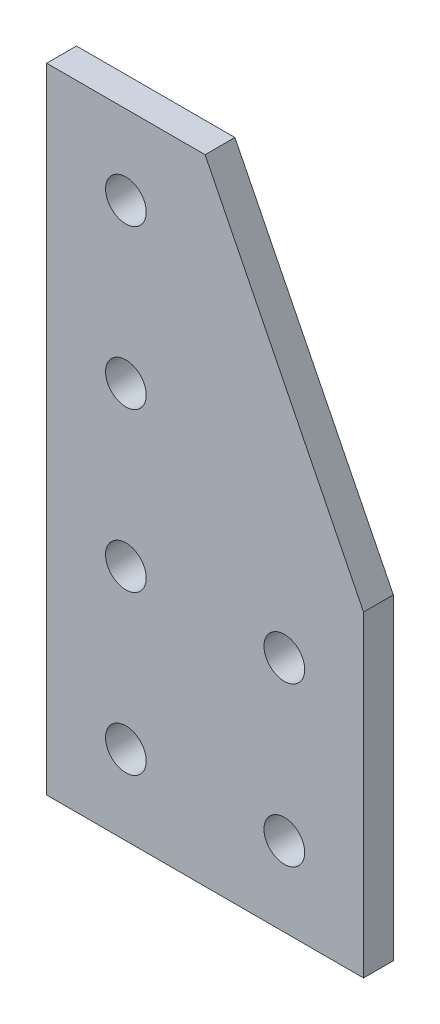
ISO-10303-21;
HEADER;
FILE_DESCRIPTION(('STEP AP214'),'2;1');
FILE_NAME('part.step','',(''),(''),'','','');
FILE_SCHEMA(('AUTOMOTIVE_DESIGN { 1 0 10303 214 1 1 1 1 }'));
ENDSEC;
DATA;
#1=APPLICATION_CONTEXT('core data for automotive mechanical design processes');
#2=APPLICATION_PROTOCOL_DEFINITION('international standard','automotive_design',2000,#1);
#3=PRODUCT_CONTEXT('',#1,'mechanical');
#4=PRODUCT('Part','Part','',(#3));
#5=PRODUCT_RELATED_PRODUCT_CATEGORY('part','',(#4));
#6=PRODUCT_DEFINITION_FORMATION('','',#4);
#7=PRODUCT_DEFINITION_CONTEXT('part definition',#1,'design');
#8=PRODUCT_DEFINITION('design','',#6,#7);
#9=PRODUCT_DEFINITION_SHAPE('','',#8);
#10=(LENGTH_UNIT() NAMED_UNIT(*) SI_UNIT(.MILLI.,.METRE.));
#11=(NAMED_UNIT(*) PLANE_ANGLE_UNIT() SI_UNIT($,.RADIAN.));
#12=(NAMED_UNIT(*) SI_UNIT($,.STERADIAN.) SOLID_ANGLE_UNIT());
#13=UNCERTAINTY_MEASURE_WITH_UNIT(LENGTH_MEASURE(1.E-05),#10,'distance_accuracy_value','');
#14=(GEOMETRIC_REPRESENTATION_CONTEXT(3) GLOBAL_UNCERTAINTY_ASSIGNED_CONTEXT((#13)) GLOBAL_UNIT_ASSIGNED_CONTEXT((#10,
#11,#12)) REPRESENTATION_CONTEXT('',''));
#15=CARTESIAN_POINT('',(0.,0.,0.));
#16=DIRECTION('',(0.,0.,1.));
#17=DIRECTION('',(1.,0.,0.));
#18=AXIS2_PLACEMENT_3D('',#15,#16,#17);
#19=CARTESIAN_POINT('',(25.4,0.,2.3876));
#20=DIRECTION('',(-0.894427190999916,-0.447213595499958,0.));
#21=DIRECTION('',(0.447213595499958,-0.894427190999916,0.));
#22=AXIS2_PLACEMENT_3D('',#19,#20,#21);
#23=PLANE('',#22);
#24=DIRECTION('',(0.,0.,-1.));
#25=VECTOR('',#24,1.);
#26=CARTESIAN_POINT('',(25.4,0.,2.3876));
#27=LINE('',#26,#25);
#28=CARTESIAN_POINT('',(25.4,0.,2.3876));
#29=VERTEX_POINT('',#28);
#30=CARTESIAN_POINT('',(25.4,0.,-2.3876));
#31=VERTEX_POINT('',#30);
#32=EDGE_CURVE('E107',#29,#31,#27,.T.);
#33=ORIENTED_EDGE('',*,*,#32,.T.);
#34=DIRECTION('',(-0.447213595499958,0.894427190999916,0.));
#35=VECTOR('',#34,1.);
#36=CARTESIAN_POINT('',(25.4,0.,-2.3876));
#37=LINE('',#36,#35);
#38=CARTESIAN_POINT('',(0.,50.8,-2.3876));
#39=VERTEX_POINT('',#38);
#40=EDGE_CURVE('E100',#31,#39,#37,.T.);
#41=ORIENTED_EDGE('',*,*,#40,.T.);
#42=DIRECTION('',(0.,0.,-1.));
#43=VECTOR('',#42,1.);
#44=CARTESIAN_POINT('',(0.,50.8,2.3876));
#45=LINE('',#44,#43);
#46=CARTESIAN_POINT('',(0.,50.8,2.3876));
#47=VERTEX_POINT('',#46);
#48=EDGE_CURVE('E11',#47,#39,#45,.T.);
#49=ORIENTED_EDGE('',*,*,#48,.F.);
#50=DIRECTION('',(-0.447213595499958,0.894427190999916,0.));
#51=VECTOR('',#50,1.);
#52=CARTESIAN_POINT('',(25.4,0.,2.3876));
#53=LINE('',#52,#51);
#54=EDGE_CURVE('E128',#29,#47,#53,.T.);
#55=ORIENTED_EDGE('',*,*,#54,.F.);
#56=EDGE_LOOP('',(#33,#41,#49,#55));
#57=FACE_BOUND('',#56,.T.);
#58=ADVANCED_FACE('F41',(#57),#23,.F.);
#59=CARTESIAN_POINT('',(0.,50.8,2.3876));
#60=DIRECTION('',(0.,-1.,0.));
#61=DIRECTION('',(0.,0.,-1.));
#62=AXIS2_PLACEMENT_3D('',#59,#60,#61);
#63=PLANE('',#62);
#64=ORIENTED_EDGE('',*,*,#48,.T.);
#65=DIRECTION('',(-1.,0.,0.));
#66=VECTOR('',#65,1.);
#67=CARTESIAN_POINT('',(0.,50.8,-2.3876));
#68=LINE('',#67,#66);
#69=CARTESIAN_POINT('',(-25.4,50.8,-2.3876));
#70=VERTEX_POINT('',#69);
#71=EDGE_CURVE('E90',#39,#70,#68,.T.);
#72=ORIENTED_EDGE('',*,*,#71,.T.);
#73=DIRECTION('',(0.,0.,-1.));
#74=VECTOR('',#73,1.);
#75=CARTESIAN_POINT('',(-25.4,50.8,2.3876));
#76=LINE('',#75,#74);
#77=CARTESIAN_POINT('',(-25.4,50.8,2.3876));
#78=VERTEX_POINT('',#77);
#79=EDGE_CURVE('E49',#78,#70,#76,.T.);
#80=ORIENTED_EDGE('',*,*,#79,.F.);
#81=DIRECTION('',(-1.,0.,0.));
#82=VECTOR('',#81,1.);
#83=CARTESIAN_POINT('',(0.,50.8,2.3876));
#84=LINE('',#83,#82);
#85=EDGE_CURVE('E91',#47,#78,#84,.T.);
#86=ORIENTED_EDGE('',*,*,#85,.F.);
#87=EDGE_LOOP('',(#64,#72,#80,#86));
#88=FACE_BOUND('',#87,.T.);
#89=ADVANCED_FACE('F88',(#88),#63,.F.);
#90=CARTESIAN_POINT('',(-25.4,50.8,2.3876));
#91=DIRECTION('',(1.,0.,0.));
#92=DIRECTION('',(0.,0.,-1.));
#93=AXIS2_PLACEMENT_3D('',#90,#91,#92);
#94=PLANE('',#93);
#95=ORIENTED_EDGE('',*,*,#79,.T.);
#96=DIRECTION('',(0.,-1.,0.));
#97=VECTOR('',#96,1.);
#98=CARTESIAN_POINT('',(-25.4,50.8,-2.3876));
#99=LINE('',#98,#97);
#100=CARTESIAN_POINT('',(-25.4,-50.8,-2.3876));
#101=VERTEX_POINT('',#100);
#102=EDGE_CURVE('E104',#70,#101,#99,.T.);
#103=ORIENTED_EDGE('',*,*,#102,.T.);
#104=DIRECTION('',(0.,0.,-1.));
#105=VECTOR('',#104,1.);
#106=CARTESIAN_POINT('',(-25.4,-50.8,2.3876));
#107=LINE('',#106,#105);
#108=CARTESIAN_POINT('',(-25.4,-50.8,2.3876));
#109=VERTEX_POINT('',#108);
#110=EDGE_CURVE('E144',#109,#101,#107,.T.);
#111=ORIENTED_EDGE('',*,*,#110,.F.);
#112=DIRECTION('',(0.,-1.,0.));
#113=VECTOR('',#112,1.);
#114=CARTESIAN_POINT('',(-25.4,50.8,2.3876));
#115=LINE('',#114,#113);
#116=EDGE_CURVE('E133',#78,#109,#115,.T.);
#117=ORIENTED_EDGE('',*,*,#116,.F.);
#118=EDGE_LOOP('',(#95,#103,#111,#117));
#119=FACE_BOUND('',#118,.T.);
#120=ADVANCED_FACE('F150',(#119),#94,.F.);
#121=CARTESIAN_POINT('',(-25.4,-50.8,2.3876));
#122=DIRECTION('',(0.,1.,0.));
#123=DIRECTION('',(-1.,0.,0.));
#124=AXIS2_PLACEMENT_3D('',#121,#122,#123);
#125=PLANE('',#124);
#126=ORIENTED_EDGE('',*,*,#110,.T.);
#127=DIRECTION('',(1.,0.,0.));
#128=VECTOR('',#127,1.);
#129=CARTESIAN_POINT('',(-25.4,-50.8,-2.3876));
#130=LINE('',#129,#128);
#131=CARTESIAN_POINT('',(25.4,-50.8,-2.3876));
#132=VERTEX_POINT('',#131);
#133=EDGE_CURVE('E121',#101,#132,#130,.T.);
#134=ORIENTED_EDGE('',*,*,#133,.T.);
#135=DIRECTION('',(0.,0.,-1.));
#136=VECTOR('',#135,1.);
#137=CARTESIAN_POINT('',(25.4,-50.8,2.3876));
#138=LINE('',#137,#136);
#139=CARTESIAN_POINT('',(25.4,-50.8,2.3876));
#140=VERTEX_POINT('',#139);
#141=EDGE_CURVE('E141',#140,#132,#138,.T.);
#142=ORIENTED_EDGE('',*,*,#141,.F.);
#143=DIRECTION('',(1.,0.,0.));
#144=VECTOR('',#143,1.);
#145=CARTESIAN_POINT('',(-25.4,-50.8,2.3876));
#146=LINE('',#145,#144);
#147=EDGE_CURVE('E61',#109,#140,#146,.T.);
#148=ORIENTED_EDGE('',*,*,#147,.F.);
#149=EDGE_LOOP('',(#126,#134,#142,#148));
#150=FACE_BOUND('',#149,.T.);
#151=ADVANCED_FACE('F164',(#150),#125,.F.);
#152=CARTESIAN_POINT('',(25.4,-50.8,2.3876));
#153=DIRECTION('',(-1.,0.,0.));
#154=DIRECTION('',(0.,0.,1.));
#155=AXIS2_PLACEMENT_3D('',#152,#153,#154);
#156=PLANE('',#155);
#157=ORIENTED_EDGE('',*,*,#141,.T.);
#158=DIRECTION('',(0.,1.,0.));
#159=VECTOR('',#158,1.);
#160=CARTESIAN_POINT('',(25.4,-50.8,-2.3876));
#161=LINE('',#160,#159);
#162=EDGE_CURVE('E125',#132,#31,#161,.T.);
#163=ORIENTED_EDGE('',*,*,#162,.T.);
#164=ORIENTED_EDGE('',*,*,#32,.F.);
#165=DIRECTION('',(0.,1.,0.));
#166=VECTOR('',#165,1.);
#167=CARTESIAN_POINT('',(25.4,-50.8,2.3876));
#168=LINE('',#167,#166);
#169=EDGE_CURVE('E56',#140,#29,#168,.T.);
#170=ORIENTED_EDGE('',*,*,#169,.F.);
#171=EDGE_LOOP('',(#157,#163,#164,#170));
#172=FACE_BOUND('',#171,.T.);
#173=ADVANCED_FACE('F154',(#172),#156,.F.);
#174=CARTESIAN_POINT('',(0.,0.,2.3876));
#175=DIRECTION('',(0.,0.,1.));
#176=DIRECTION('',(1.,0.,0.));
#177=AXIS2_PLACEMENT_3D('',#174,#175,#176);
#178=PLANE('',#177);
#179=CARTESIAN_POINT('',(-12.7000000000003,38.1,2.3876));
#180=DIRECTION('',(0.,0.,1.));
#181=DIRECTION('',(1.,0.,0.));
#182=AXIS2_PLACEMENT_3D('',#179,#180,#181);
#183=CIRCLE('',#182,3.2639);
#184=CARTESIAN_POINT('',(-9.43610000000029,38.1,2.3876));
#185=VERTEX_POINT('',#184);
#186=EDGE_CURVE('E267',#185,#185,#183,.T.);
#187=ORIENTED_EDGE('',*,*,#186,.F.);
#188=EDGE_LOOP('',(#187));
#189=FACE_BOUND('',#188,.T.);
#190=CARTESIAN_POINT('',(-12.7000000000002,12.7,2.3876));
#191=DIRECTION('',(0.,0.,1.));
#192=DIRECTION('',(1.,0.,0.));
#193=AXIS2_PLACEMENT_3D('',#190,#191,#192);
#194=CIRCLE('',#193,3.2639);
#195=CARTESIAN_POINT('',(-9.4361000000002,12.7,2.3876));
#196=VERTEX_POINT('',#195);
#197=EDGE_CURVE('E272',#196,#196,#194,.T.);
#198=ORIENTED_EDGE('',*,*,#197,.F.);
#199=EDGE_LOOP('',(#198));
#200=FACE_BOUND('',#199,.T.);
#201=CARTESIAN_POINT('',(-12.7000000000001,-12.7,2.3876));
#202=DIRECTION('',(0.,0.,1.));
#203=DIRECTION('',(1.,0.,0.));
#204=AXIS2_PLACEMENT_3D('',#201,#202,#203);
#205=CIRCLE('',#204,3.2639);
#206=CARTESIAN_POINT('',(-9.4361000000001,-12.7,2.3876));
#207=VERTEX_POINT('',#206);
#208=EDGE_CURVE('E282',#207,#207,#205,.T.);
#209=ORIENTED_EDGE('',*,*,#208,.F.);
#210=EDGE_LOOP('',(#209));
#211=FACE_BOUND('',#210,.T.);
#212=CARTESIAN_POINT('',(12.6999999999999,-12.7,2.3876));
#213=DIRECTION('',(0.,0.,1.));
#214=DIRECTION('',(1.,0.,0.));
#215=AXIS2_PLACEMENT_3D('',#212,#213,#214);
#216=CIRCLE('',#215,3.2639);
#217=CARTESIAN_POINT('',(15.9638999999999,-12.7,2.3876));
#218=VERTEX_POINT('',#217);
#219=EDGE_CURVE('E290',#218,#218,#216,.T.);
#220=ORIENTED_EDGE('',*,*,#219,.F.);
#221=EDGE_LOOP('',(#220));
#222=FACE_BOUND('',#221,.T.);
#223=CARTESIAN_POINT('',(12.7,-38.1,2.3876));
#224=DIRECTION('',(0.,0.,1.));
#225=DIRECTION('',(1.,0.,0.));
#226=AXIS2_PLACEMENT_3D('',#223,#224,#225);
#227=CIRCLE('',#226,3.2639);
#228=CARTESIAN_POINT('',(15.9639,-38.1,2.3876));
#229=VERTEX_POINT('',#228);
#230=EDGE_CURVE('E298',#229,#229,#227,.T.);
#231=ORIENTED_EDGE('',*,*,#230,.F.);
#232=EDGE_LOOP('',(#231));
#233=FACE_BOUND('',#232,.T.);
#234=CARTESIAN_POINT('',(-12.7,-38.1,2.3876));
#235=DIRECTION('',(0.,0.,1.));
#236=DIRECTION('',(1.,0.,0.));
#237=AXIS2_PLACEMENT_3D('',#234,#235,#236);
#238=CIRCLE('',#237,3.2639);
#239=CARTESIAN_POINT('',(-9.43610000000001,-38.1,2.3876));
#240=VERTEX_POINT('',#239);
#241=EDGE_CURVE('E115',#240,#240,#238,.T.);
#242=ORIENTED_EDGE('',*,*,#241,.F.);
#243=EDGE_LOOP('',(#242));
#244=FACE_BOUND('',#243,.T.);
#245=ORIENTED_EDGE('',*,*,#54,.T.);
#246=ORIENTED_EDGE('',*,*,#85,.T.);
#247=ORIENTED_EDGE('',*,*,#116,.T.);
#248=ORIENTED_EDGE('',*,*,#147,.T.);
#249=ORIENTED_EDGE('',*,*,#169,.T.);
#250=EDGE_LOOP('',(#245,#246,#247,#248,#249));
#251=FACE_BOUND('',#250,.T.);
#252=ADVANCED_FACE('F152',(#189,#200,#211,#222,#233,#244,#251),#178,.T.);
#253=CARTESIAN_POINT('',(0.,0.,-2.3876));
#254=DIRECTION('',(0.,0.,1.));
#255=DIRECTION('',(1.,0.,0.));
#256=AXIS2_PLACEMENT_3D('',#253,#254,#255);
#257=PLANE('',#256);
#258=CARTESIAN_POINT('',(-12.7000000000003,38.1,-2.3876));
#259=DIRECTION('',(0.,0.,1.));
#260=DIRECTION('',(1.,0.,0.));
#261=AXIS2_PLACEMENT_3D('',#258,#259,#260);
#262=CIRCLE('',#261,3.2639);
#263=CARTESIAN_POINT('',(-9.43610000000029,38.1,-2.3876));
#264=VERTEX_POINT('',#263);
#265=EDGE_CURVE('E265',#264,#264,#262,.T.);
#266=ORIENTED_EDGE('',*,*,#265,.T.);
#267=EDGE_LOOP('',(#266));
#268=FACE_BOUND('',#267,.T.);
#269=CARTESIAN_POINT('',(-12.7000000000002,12.7,-2.3876));
#270=DIRECTION('',(0.,0.,1.));
#271=DIRECTION('',(1.,0.,0.));
#272=AXIS2_PLACEMENT_3D('',#269,#270,#271);
#273=CIRCLE('',#272,3.2639);
#274=CARTESIAN_POINT('',(-9.4361000000002,12.7,-2.3876));
#275=VERTEX_POINT('',#274);
#276=EDGE_CURVE('E278',#275,#275,#273,.T.);
#277=ORIENTED_EDGE('',*,*,#276,.T.);
#278=EDGE_LOOP('',(#277));
#279=FACE_BOUND('',#278,.T.);
#280=CARTESIAN_POINT('',(-12.7000000000001,-12.7,-2.3876));
#281=DIRECTION('',(0.,0.,1.));
#282=DIRECTION('',(1.,0.,0.));
#283=AXIS2_PLACEMENT_3D('',#280,#281,#282);
#284=CIRCLE('',#283,3.2639);
#285=CARTESIAN_POINT('',(-9.4361000000001,-12.7,-2.3876));
#286=VERTEX_POINT('',#285);
#287=EDGE_CURVE('E286',#286,#286,#284,.T.);
#288=ORIENTED_EDGE('',*,*,#287,.T.);
#289=EDGE_LOOP('',(#288));
#290=FACE_BOUND('',#289,.T.);
#291=CARTESIAN_POINT('',(12.6999999999999,-12.7,-2.3876));
#292=DIRECTION('',(0.,0.,1.));
#293=DIRECTION('',(1.,0.,0.));
#294=AXIS2_PLACEMENT_3D('',#291,#292,#293);
#295=CIRCLE('',#294,3.2639);
#296=CARTESIAN_POINT('',(15.9638999999999,-12.7,-2.3876));
#297=VERTEX_POINT('',#296);
#298=EDGE_CURVE('E294',#297,#297,#295,.T.);
#299=ORIENTED_EDGE('',*,*,#298,.T.);
#300=EDGE_LOOP('',(#299));
#301=FACE_BOUND('',#300,.T.);
#302=CARTESIAN_POINT('',(12.7,-38.1,-2.3876));
#303=DIRECTION('',(0.,0.,1.));
#304=DIRECTION('',(1.,0.,0.));
#305=AXIS2_PLACEMENT_3D('',#302,#303,#304);
#306=CIRCLE('',#305,3.2639);
#307=CARTESIAN_POINT('',(15.9639,-38.1,-2.3876));
#308=VERTEX_POINT('',#307);
#309=EDGE_CURVE('E302',#308,#308,#306,.T.);
#310=ORIENTED_EDGE('',*,*,#309,.T.);
#311=EDGE_LOOP('',(#310));
#312=FACE_BOUND('',#311,.T.);
#313=CARTESIAN_POINT('',(-12.7,-38.1,-2.3876));
#314=DIRECTION('',(0.,0.,1.));
#315=DIRECTION('',(1.,0.,0.));
#316=AXIS2_PLACEMENT_3D('',#313,#314,#315);
#317=CIRCLE('',#316,3.2639);
#318=CARTESIAN_POINT('',(-9.43610000000001,-38.1,-2.3876));
#319=VERTEX_POINT('',#318);
#320=EDGE_CURVE('E109',#319,#319,#317,.T.);
#321=ORIENTED_EDGE('',*,*,#320,.T.);
#322=EDGE_LOOP('',(#321));
#323=FACE_BOUND('',#322,.T.);
#324=ORIENTED_EDGE('',*,*,#40,.F.);
#325=ORIENTED_EDGE('',*,*,#162,.F.);
#326=ORIENTED_EDGE('',*,*,#133,.F.);
#327=ORIENTED_EDGE('',*,*,#102,.F.);
#328=ORIENTED_EDGE('',*,*,#71,.F.);
#329=EDGE_LOOP('',(#324,#325,#326,#327,#328));
#330=FACE_BOUND('',#329,.T.);
#331=ADVANCED_FACE('F98',(#268,#279,#290,#301,#312,#323,#330),#257,.F.);
#332=CARTESIAN_POINT('',(-12.7,-38.1,-2.3876));
#333=DIRECTION('',(0.,0.,1.));
#334=DIRECTION('',(1.,0.,0.));
#335=AXIS2_PLACEMENT_3D('',#332,#333,#334);
#336=CYLINDRICAL_SURFACE('',#335,3.2639);
#337=ORIENTED_EDGE('',*,*,#320,.F.);
#338=EDGE_LOOP('',(#337));
#339=FACE_BOUND('',#338,.T.);
#340=ORIENTED_EDGE('',*,*,#241,.T.);
#341=EDGE_LOOP('',(#340));
#342=FACE_BOUND('',#341,.T.);
#343=ADVANCED_FACE('F161',(#339,#342),#336,.F.);
#344=CARTESIAN_POINT('',(12.7,-38.1,-2.3876));
#345=DIRECTION('',(0.,0.,1.));
#346=DIRECTION('',(1.,0.,0.));
#347=AXIS2_PLACEMENT_3D('',#344,#345,#346);
#348=CYLINDRICAL_SURFACE('',#347,3.2639);
#349=ORIENTED_EDGE('',*,*,#309,.F.);
#350=EDGE_LOOP('',(#349));
#351=FACE_BOUND('',#350,.T.);
#352=ORIENTED_EDGE('',*,*,#230,.T.);
#353=EDGE_LOOP('',(#352));
#354=FACE_BOUND('',#353,.T.);
#355=ADVANCED_FACE('F209',(#351,#354),#348,.F.);
#356=CARTESIAN_POINT('',(12.6999999999999,-12.7,-2.3876));
#357=DIRECTION('',(0.,0.,1.));
#358=DIRECTION('',(1.,0.,0.));
#359=AXIS2_PLACEMENT_3D('',#356,#357,#358);
#360=CYLINDRICAL_SURFACE('',#359,3.2639);
#361=ORIENTED_EDGE('',*,*,#298,.F.);
#362=EDGE_LOOP('',(#361));
#363=FACE_BOUND('',#362,.T.);
#364=ORIENTED_EDGE('',*,*,#219,.T.);
#365=EDGE_LOOP('',(#364));
#366=FACE_BOUND('',#365,.T.);
#367=ADVANCED_FACE('F219',(#363,#366),#360,.F.);
#368=CARTESIAN_POINT('',(-12.7000000000001,-12.7,-2.3876));
#369=DIRECTION('',(0.,0.,1.));
#370=DIRECTION('',(1.,0.,0.));
#371=AXIS2_PLACEMENT_3D('',#368,#369,#370);
#372=CYLINDRICAL_SURFACE('',#371,3.2639);
#373=ORIENTED_EDGE('',*,*,#287,.F.);
#374=EDGE_LOOP('',(#373));
#375=FACE_BOUND('',#374,.T.);
#376=ORIENTED_EDGE('',*,*,#208,.T.);
#377=EDGE_LOOP('',(#376));
#378=FACE_BOUND('',#377,.T.);
#379=ADVANCED_FACE('F229',(#375,#378),#372,.F.);
#380=CARTESIAN_POINT('',(-12.7000000000002,12.7,-2.3876));
#381=DIRECTION('',(0.,0.,1.));
#382=DIRECTION('',(1.,0.,0.));
#383=AXIS2_PLACEMENT_3D('',#380,#381,#382);
#384=CYLINDRICAL_SURFACE('',#383,3.2639);
#385=ORIENTED_EDGE('',*,*,#276,.F.);
#386=EDGE_LOOP('',(#385));
#387=FACE_BOUND('',#386,.T.);
#388=ORIENTED_EDGE('',*,*,#197,.T.);
#389=EDGE_LOOP('',(#388));
#390=FACE_BOUND('',#389,.T.);
#391=ADVANCED_FACE('F239',(#387,#390),#384,.F.);
#392=CARTESIAN_POINT('',(-12.7000000000003,38.1,-2.3876));
#393=DIRECTION('',(0.,0.,1.));
#394=DIRECTION('',(1.,0.,0.));
#395=AXIS2_PLACEMENT_3D('',#392,#393,#394);
#396=CYLINDRICAL_SURFACE('',#395,3.2639);
#397=ORIENTED_EDGE('',*,*,#265,.F.);
#398=EDGE_LOOP('',(#397));
#399=FACE_BOUND('',#398,.T.);
#400=ORIENTED_EDGE('',*,*,#186,.T.);
#401=EDGE_LOOP('',(#400));
#402=FACE_BOUND('',#401,.T.);
#403=ADVANCED_FACE('F249',(#399,#402),#396,.F.);
#404=CLOSED_SHELL('',(#58,#89,#120,#151,#173,#252,#331,#343,#355,#367,#379,#391,#403));
#405=MANIFOLD_SOLID_BREP('B2',#404);
#406=ADVANCED_BREP_SHAPE_REPRESENTATION('',(#18,#405),#14);
#407=SHAPE_DEFINITION_REPRESENTATION(#9,#406);
ENDSEC;
END-ISO-10303-21;
